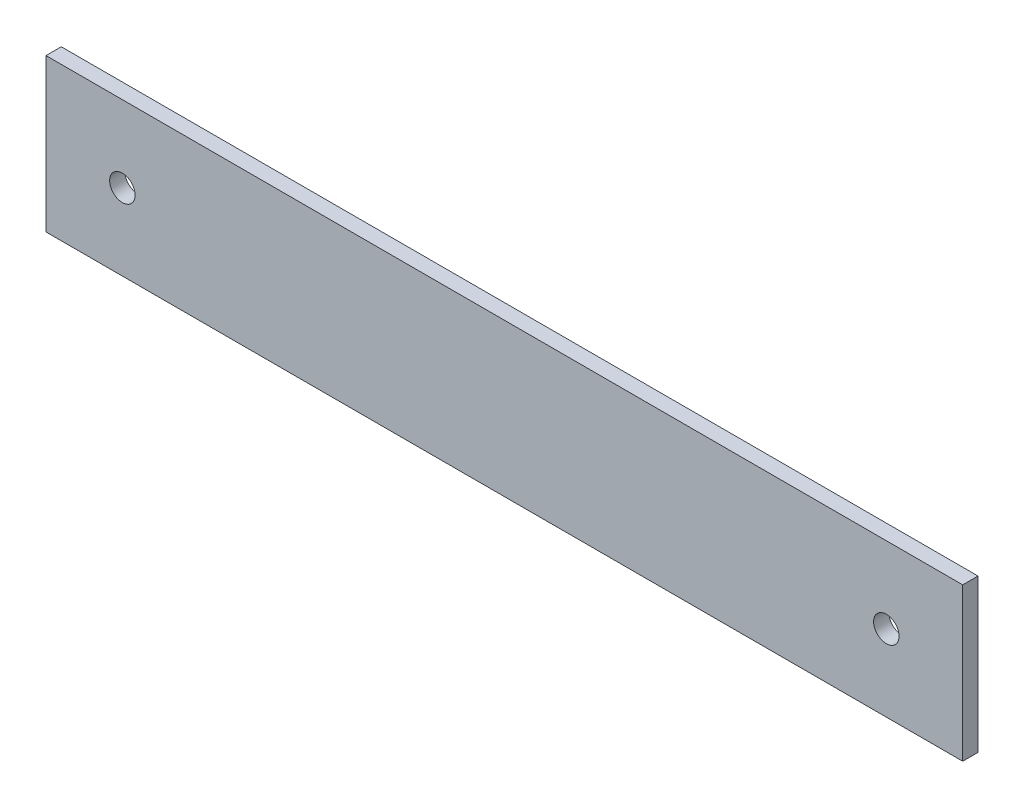
ISO-10303-21;
HEADER;
FILE_DESCRIPTION(('STEP AP214'),'2;1');
FILE_NAME('part.step','',(''),(''),'','','');
FILE_SCHEMA(('AUTOMOTIVE_DESIGN { 1 0 10303 214 1 1 1 1 }'));
ENDSEC;
DATA;
#1=APPLICATION_CONTEXT('core data for automotive mechanical design processes');
#2=APPLICATION_PROTOCOL_DEFINITION('international standard','automotive_design',2000,#1);
#3=PRODUCT_CONTEXT('',#1,'mechanical');
#4=PRODUCT('Part','Part','',(#3));
#5=PRODUCT_RELATED_PRODUCT_CATEGORY('part','',(#4));
#6=PRODUCT_DEFINITION_FORMATION('','',#4);
#7=PRODUCT_DEFINITION_CONTEXT('part definition',#1,'design');
#8=PRODUCT_DEFINITION('design','',#6,#7);
#9=PRODUCT_DEFINITION_SHAPE('','',#8);
#10=(LENGTH_UNIT() NAMED_UNIT(*) SI_UNIT(.MILLI.,.METRE.));
#11=(NAMED_UNIT(*) PLANE_ANGLE_UNIT() SI_UNIT($,.RADIAN.));
#12=(NAMED_UNIT(*) SI_UNIT($,.STERADIAN.) SOLID_ANGLE_UNIT());
#13=UNCERTAINTY_MEASURE_WITH_UNIT(LENGTH_MEASURE(1.E-05),#10,'distance_accuracy_value','');
#14=(GEOMETRIC_REPRESENTATION_CONTEXT(3) GLOBAL_UNCERTAINTY_ASSIGNED_CONTEXT((#13)) GLOBAL_UNIT_ASSIGNED_CONTEXT((#10,
#11,#12)) REPRESENTATION_CONTEXT('',''));
#15=CARTESIAN_POINT('',(0.,0.,0.));
#16=DIRECTION('',(0.,0.,1.));
#17=DIRECTION('',(1.,0.,0.));
#18=AXIS2_PLACEMENT_3D('',#15,#16,#17);
#19=CARTESIAN_POINT('',(0.,0.,3.));
#20=DIRECTION('',(0.,0.,-1.));
#21=DIRECTION('',(-1.,0.,0.));
#22=AXIS2_PLACEMENT_3D('',#19,#20,#21);
#23=PLANE('',#22);
#24=DIRECTION('',(0.,-1.,0.));
#25=VECTOR('',#24,1.);
#26=CARTESIAN_POINT('',(0.,0.,3.));
#27=LINE('',#26,#25);
#28=CARTESIAN_POINT('',(0.,30.,3.));
#29=VERTEX_POINT('',#28);
#30=CARTESIAN_POINT('',(0.,0.,3.));
#31=VERTEX_POINT('',#30);
#32=EDGE_CURVE('E84',#29,#31,#27,.T.);
#33=ORIENTED_EDGE('',*,*,#32,.T.);
#34=DIRECTION('',(1.,0.,0.));
#35=VECTOR('',#34,1.);
#36=CARTESIAN_POINT('',(0.,0.,3.));
#37=LINE('',#36,#35);
#38=CARTESIAN_POINT('',(180.,0.,3.));
#39=VERTEX_POINT('',#38);
#40=EDGE_CURVE('E79',#31,#39,#37,.T.);
#41=ORIENTED_EDGE('',*,*,#40,.T.);
#42=DIRECTION('',(0.,1.,0.));
#43=VECTOR('',#42,1.);
#44=CARTESIAN_POINT('',(180.,0.,3.));
#45=LINE('',#44,#43);
#46=CARTESIAN_POINT('',(180.,30.,3.));
#47=VERTEX_POINT('',#46);
#48=EDGE_CURVE('E82',#39,#47,#45,.T.);
#49=ORIENTED_EDGE('',*,*,#48,.T.);
#50=DIRECTION('',(-1.,0.,0.));
#51=VECTOR('',#50,1.);
#52=CARTESIAN_POINT('',(0.,30.,3.));
#53=LINE('',#52,#51);
#54=EDGE_CURVE('E49',#47,#29,#53,.T.);
#55=ORIENTED_EDGE('',*,*,#54,.T.);
#56=EDGE_LOOP('',(#33,#41,#49,#55));
#57=FACE_BOUND('',#56,.T.);
#58=CARTESIAN_POINT('',(15.,15.,3.));
#59=DIRECTION('',(0.,0.,1.));
#60=DIRECTION('',(1.,0.,0.));
#61=AXIS2_PLACEMENT_3D('',#58,#59,#60);
#62=CIRCLE('',#61,2.49999999999999);
#63=CARTESIAN_POINT('',(17.5,15.,3.));
#64=VERTEX_POINT('',#63);
#65=EDGE_CURVE('E99',#64,#64,#62,.T.);
#66=ORIENTED_EDGE('',*,*,#65,.F.);
#67=EDGE_LOOP('',(#66));
#68=FACE_BOUND('',#67,.T.);
#69=CARTESIAN_POINT('',(165.,15.,3.));
#70=DIRECTION('',(0.,0.,1.));
#71=DIRECTION('',(1.,0.,0.));
#72=AXIS2_PLACEMENT_3D('',#69,#70,#71);
#73=CIRCLE('',#72,2.5);
#74=CARTESIAN_POINT('',(167.5,15.,3.));
#75=VERTEX_POINT('',#74);
#76=EDGE_CURVE('E114',#75,#75,#73,.T.);
#77=ORIENTED_EDGE('',*,*,#76,.F.);
#78=EDGE_LOOP('',(#77));
#79=FACE_BOUND('',#78,.T.);
#80=ADVANCED_FACE('F32',(#57,#68,#79),#23,.F.);
#81=CARTESIAN_POINT('',(0.,0.,0.));
#82=DIRECTION('',(0.,0.,-1.));
#83=DIRECTION('',(-1.,0.,0.));
#84=AXIS2_PLACEMENT_3D('',#81,#82,#83);
#85=PLANE('',#84);
#86=CARTESIAN_POINT('',(15.,15.,0.));
#87=DIRECTION('',(0.,0.,1.));
#88=DIRECTION('',(1.,0.,0.));
#89=AXIS2_PLACEMENT_3D('',#86,#87,#88);
#90=CIRCLE('',#89,2.49999999999999);
#91=CARTESIAN_POINT('',(17.5,15.,0.));
#92=VERTEX_POINT('',#91);
#93=EDGE_CURVE('E111',#92,#92,#90,.T.);
#94=ORIENTED_EDGE('',*,*,#93,.T.);
#95=EDGE_LOOP('',(#94));
#96=FACE_BOUND('',#95,.T.);
#97=DIRECTION('',(0.,-1.,0.));
#98=VECTOR('',#97,1.);
#99=CARTESIAN_POINT('',(0.,0.,0.));
#100=LINE('',#99,#98);
#101=CARTESIAN_POINT('',(0.,30.,0.));
#102=VERTEX_POINT('',#101);
#103=CARTESIAN_POINT('',(0.,0.,0.));
#104=VERTEX_POINT('',#103);
#105=EDGE_CURVE('E96',#102,#104,#100,.T.);
#106=ORIENTED_EDGE('',*,*,#105,.F.);
#107=DIRECTION('',(-1.,0.,0.));
#108=VECTOR('',#107,1.);
#109=CARTESIAN_POINT('',(0.,30.,0.));
#110=LINE('',#109,#108);
#111=CARTESIAN_POINT('',(180.,30.,0.));
#112=VERTEX_POINT('',#111);
#113=EDGE_CURVE('E72',#112,#102,#110,.T.);
#114=ORIENTED_EDGE('',*,*,#113,.F.);
#115=DIRECTION('',(0.,1.,0.));
#116=VECTOR('',#115,1.);
#117=CARTESIAN_POINT('',(180.,0.,0.));
#118=LINE('',#117,#116);
#119=CARTESIAN_POINT('',(180.,0.,0.));
#120=VERTEX_POINT('',#119);
#121=EDGE_CURVE('E66',#120,#112,#118,.T.);
#122=ORIENTED_EDGE('',*,*,#121,.F.);
#123=DIRECTION('',(1.,0.,0.));
#124=VECTOR('',#123,1.);
#125=CARTESIAN_POINT('',(0.,0.,0.));
#126=LINE('',#125,#124);
#127=EDGE_CURVE('E88',#104,#120,#126,.T.);
#128=ORIENTED_EDGE('',*,*,#127,.F.);
#129=EDGE_LOOP('',(#106,#114,#122,#128));
#130=FACE_BOUND('',#129,.T.);
#131=CARTESIAN_POINT('',(165.,15.,0.));
#132=DIRECTION('',(0.,0.,1.));
#133=DIRECTION('',(1.,0.,0.));
#134=AXIS2_PLACEMENT_3D('',#131,#132,#133);
#135=CIRCLE('',#134,2.5);
#136=CARTESIAN_POINT('',(167.5,15.,0.));
#137=VERTEX_POINT('',#136);
#138=EDGE_CURVE('E117',#137,#137,#135,.T.);
#139=ORIENTED_EDGE('',*,*,#138,.T.);
#140=EDGE_LOOP('',(#139));
#141=FACE_BOUND('',#140,.T.);
#142=ADVANCED_FACE('F107',(#96,#130,#141),#85,.T.);
#143=CARTESIAN_POINT('',(0.,0.,3.));
#144=DIRECTION('',(1.,0.,0.));
#145=DIRECTION('',(0.,0.,-1.));
#146=AXIS2_PLACEMENT_3D('',#143,#144,#145);
#147=PLANE('',#146);
#148=ORIENTED_EDGE('',*,*,#105,.T.);
#149=DIRECTION('',(0.,0.,-1.));
#150=VECTOR('',#149,1.);
#151=CARTESIAN_POINT('',(0.,0.,3.));
#152=LINE('',#151,#150);
#153=EDGE_CURVE('E11',#31,#104,#152,.T.);
#154=ORIENTED_EDGE('',*,*,#153,.F.);
#155=ORIENTED_EDGE('',*,*,#32,.F.);
#156=DIRECTION('',(0.,0.,-1.));
#157=VECTOR('',#156,1.);
#158=CARTESIAN_POINT('',(0.,30.,3.));
#159=LINE('',#158,#157);
#160=EDGE_CURVE('E92',#29,#102,#159,.T.);
#161=ORIENTED_EDGE('',*,*,#160,.T.);
#162=EDGE_LOOP('',(#148,#154,#155,#161));
#163=FACE_BOUND('',#162,.T.);
#164=ADVANCED_FACE('F34',(#163),#147,.F.);
#165=CARTESIAN_POINT('',(0.,0.,3.));
#166=DIRECTION('',(0.,1.,0.));
#167=DIRECTION('',(0.,0.,1.));
#168=AXIS2_PLACEMENT_3D('',#165,#166,#167);
#169=PLANE('',#168);
#170=ORIENTED_EDGE('',*,*,#127,.T.);
#171=DIRECTION('',(0.,0.,-1.));
#172=VECTOR('',#171,1.);
#173=CARTESIAN_POINT('',(180.,0.,3.));
#174=LINE('',#173,#172);
#175=EDGE_CURVE('E41',#39,#120,#174,.T.);
#176=ORIENTED_EDGE('',*,*,#175,.F.);
#177=ORIENTED_EDGE('',*,*,#40,.F.);
#178=ORIENTED_EDGE('',*,*,#153,.T.);
#179=EDGE_LOOP('',(#170,#176,#177,#178));
#180=FACE_BOUND('',#179,.T.);
#181=ADVANCED_FACE('F87',(#180),#169,.F.);
#182=CARTESIAN_POINT('',(180.,0.,3.));
#183=DIRECTION('',(-1.,0.,0.));
#184=DIRECTION('',(0.,-1.,0.));
#185=AXIS2_PLACEMENT_3D('',#182,#183,#184);
#186=PLANE('',#185);
#187=ORIENTED_EDGE('',*,*,#121,.T.);
#188=DIRECTION('',(0.,0.,-1.));
#189=VECTOR('',#188,1.);
#190=CARTESIAN_POINT('',(180.,30.,3.));
#191=LINE('',#190,#189);
#192=EDGE_CURVE('E89',#47,#112,#191,.T.);
#193=ORIENTED_EDGE('',*,*,#192,.F.);
#194=ORIENTED_EDGE('',*,*,#48,.F.);
#195=ORIENTED_EDGE('',*,*,#175,.T.);
#196=EDGE_LOOP('',(#187,#193,#194,#195));
#197=FACE_BOUND('',#196,.T.);
#198=ADVANCED_FACE('F90',(#197),#186,.F.);
#199=CARTESIAN_POINT('',(0.,30.,3.));
#200=DIRECTION('',(0.,-1.,0.));
#201=DIRECTION('',(0.,0.,-1.));
#202=AXIS2_PLACEMENT_3D('',#199,#200,#201);
#203=PLANE('',#202);
#204=ORIENTED_EDGE('',*,*,#113,.T.);
#205=ORIENTED_EDGE('',*,*,#160,.F.);
#206=ORIENTED_EDGE('',*,*,#54,.F.);
#207=ORIENTED_EDGE('',*,*,#192,.T.);
#208=EDGE_LOOP('',(#204,#205,#206,#207));
#209=FACE_BOUND('',#208,.T.);
#210=ADVANCED_FACE('F104',(#209),#203,.F.);
#211=CARTESIAN_POINT('',(15.,15.,3.));
#212=DIRECTION('',(0.,0.,-1.));
#213=DIRECTION('',(-1.,0.,0.));
#214=AXIS2_PLACEMENT_3D('',#211,#212,#213);
#215=CYLINDRICAL_SURFACE('',#214,2.49999999999999);
#216=ORIENTED_EDGE('',*,*,#65,.T.);
#217=EDGE_LOOP('',(#216));
#218=FACE_BOUND('',#217,.T.);
#219=ORIENTED_EDGE('',*,*,#93,.F.);
#220=EDGE_LOOP('',(#219));
#221=FACE_BOUND('',#220,.T.);
#222=ADVANCED_FACE('F134',(#218,#221),#215,.F.);
#223=CARTESIAN_POINT('',(165.,15.,3.));
#224=DIRECTION('',(0.,0.,-1.));
#225=DIRECTION('',(-1.,0.,0.));
#226=AXIS2_PLACEMENT_3D('',#223,#224,#225);
#227=CYLINDRICAL_SURFACE('',#226,2.5);
#228=ORIENTED_EDGE('',*,*,#76,.T.);
#229=EDGE_LOOP('',(#228));
#230=FACE_BOUND('',#229,.T.);
#231=ORIENTED_EDGE('',*,*,#138,.F.);
#232=EDGE_LOOP('',(#231));
#233=FACE_BOUND('',#232,.T.);
#234=ADVANCED_FACE('F123',(#230,#233),#227,.F.);
#235=CLOSED_SHELL('',(#80,#142,#164,#181,#198,#210,#222,#234));
#236=MANIFOLD_SOLID_BREP('B2',#235);
#237=ADVANCED_BREP_SHAPE_REPRESENTATION('',(#18,#236),#14);
#238=SHAPE_DEFINITION_REPRESENTATION(#9,#237);
ENDSEC;
END-ISO-10303-21;
